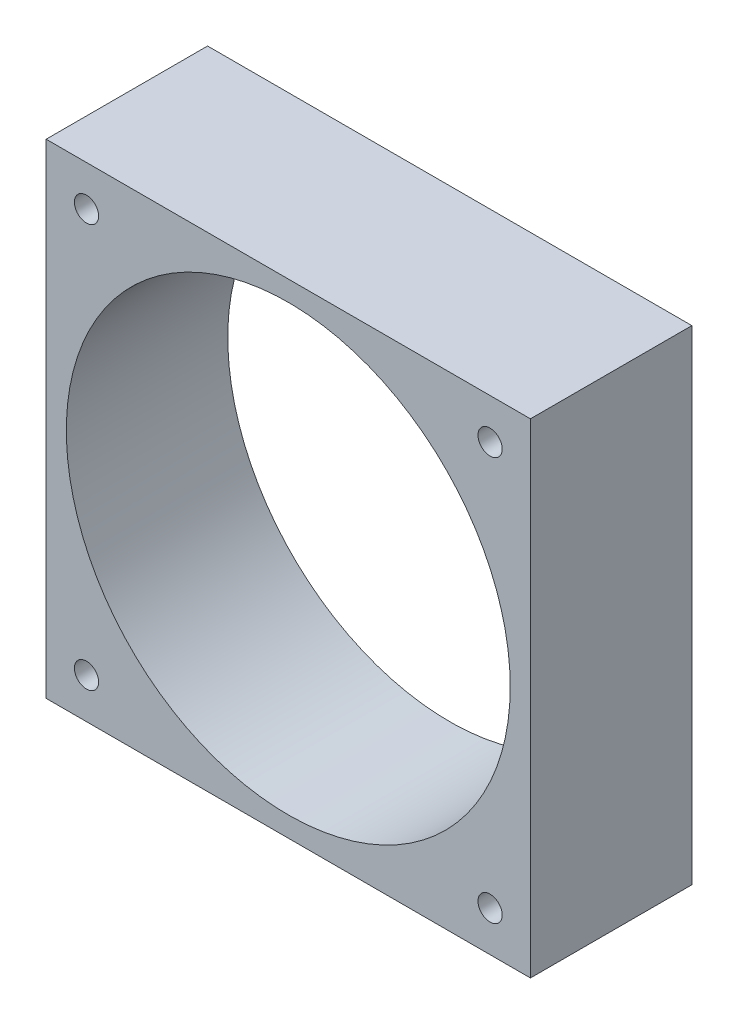
ISO-10303-21;
HEADER;
FILE_DESCRIPTION(('STEP AP214'),'2;1');
FILE_NAME('part.step','',(''),(''),'','','');
FILE_SCHEMA(('AUTOMOTIVE_DESIGN { 1 0 10303 214 1 1 1 1 }'));
ENDSEC;
DATA;
#1=APPLICATION_CONTEXT('core data for automotive mechanical design processes');
#2=APPLICATION_PROTOCOL_DEFINITION('international standard','automotive_design',2000,#1);
#3=PRODUCT_CONTEXT('',#1,'mechanical');
#4=PRODUCT('Part','Part','',(#3));
#5=PRODUCT_RELATED_PRODUCT_CATEGORY('part','',(#4));
#6=PRODUCT_DEFINITION_FORMATION('','',#4);
#7=PRODUCT_DEFINITION_CONTEXT('part definition',#1,'design');
#8=PRODUCT_DEFINITION('design','',#6,#7);
#9=PRODUCT_DEFINITION_SHAPE('','',#8);
#10=(LENGTH_UNIT() NAMED_UNIT(*) SI_UNIT(.MILLI.,.METRE.));
#11=(NAMED_UNIT(*) PLANE_ANGLE_UNIT() SI_UNIT($,.RADIAN.));
#12=(NAMED_UNIT(*) SI_UNIT($,.STERADIAN.) SOLID_ANGLE_UNIT());
#13=UNCERTAINTY_MEASURE_WITH_UNIT(LENGTH_MEASURE(1.E-05),#10,'distance_accuracy_value','');
#14=(GEOMETRIC_REPRESENTATION_CONTEXT(3) GLOBAL_UNCERTAINTY_ASSIGNED_CONTEXT((#13)) GLOBAL_UNIT_ASSIGNED_CONTEXT((#10,
#11,#12)) REPRESENTATION_CONTEXT('',''));
#15=CARTESIAN_POINT('',(0.,0.,0.));
#16=DIRECTION('',(0.,0.,1.));
#17=DIRECTION('',(1.,0.,0.));
#18=AXIS2_PLACEMENT_3D('',#15,#16,#17);
#19=CARTESIAN_POINT('',(0.,0.,20.));
#20=DIRECTION('',(0.,0.,-1.));
#21=DIRECTION('',(-1.,0.,0.));
#22=AXIS2_PLACEMENT_3D('',#19,#20,#21);
#23=PLANE('',#22);
#24=DIRECTION('',(0.,1.,0.));
#25=VECTOR('',#24,1.);
#26=CARTESIAN_POINT('',(30.,-30.,20.));
#27=LINE('',#26,#25);
#28=CARTESIAN_POINT('',(30.,-30.,20.));
#29=VERTEX_POINT('',#28);
#30=CARTESIAN_POINT('',(30.,30.,20.));
#31=VERTEX_POINT('',#30);
#32=EDGE_CURVE('E85',#29,#31,#27,.T.);
#33=ORIENTED_EDGE('',*,*,#32,.T.);
#34=DIRECTION('',(-1.,0.,0.));
#35=VECTOR('',#34,1.);
#36=CARTESIAN_POINT('',(-30.,30.,20.));
#37=LINE('',#36,#35);
#38=CARTESIAN_POINT('',(-30.,30.,20.));
#39=VERTEX_POINT('',#38);
#40=EDGE_CURVE('E80',#31,#39,#37,.T.);
#41=ORIENTED_EDGE('',*,*,#40,.T.);
#42=DIRECTION('',(0.,-1.,0.));
#43=VECTOR('',#42,1.);
#44=CARTESIAN_POINT('',(-30.,-30.,20.));
#45=LINE('',#44,#43);
#46=CARTESIAN_POINT('',(-30.,-30.,20.));
#47=VERTEX_POINT('',#46);
#48=EDGE_CURVE('E83',#39,#47,#45,.T.);
#49=ORIENTED_EDGE('',*,*,#48,.T.);
#50=DIRECTION('',(1.,0.,0.));
#51=VECTOR('',#50,1.);
#52=CARTESIAN_POINT('',(-30.,-30.,20.));
#53=LINE('',#52,#51);
#54=EDGE_CURVE('E50',#47,#29,#53,.T.);
#55=ORIENTED_EDGE('',*,*,#54,.T.);
#56=EDGE_LOOP('',(#33,#41,#49,#55));
#57=FACE_BOUND('',#56,.T.);
#58=CARTESIAN_POINT('',(25.,25.,20.));
#59=DIRECTION('',(0.,0.,1.));
#60=DIRECTION('',(1.,0.,0.));
#61=AXIS2_PLACEMENT_3D('',#58,#59,#60);
#62=CIRCLE('',#61,1.5);
#63=CARTESIAN_POINT('',(26.5,25.,20.));
#64=VERTEX_POINT('',#63);
#65=EDGE_CURVE('E100',#64,#64,#62,.T.);
#66=ORIENTED_EDGE('',*,*,#65,.F.);
#67=EDGE_LOOP('',(#66));
#68=FACE_BOUND('',#67,.T.);
#69=CARTESIAN_POINT('',(-25.,25.,20.));
#70=DIRECTION('',(0.,0.,1.));
#71=DIRECTION('',(1.,0.,0.));
#72=AXIS2_PLACEMENT_3D('',#69,#70,#71);
#73=CIRCLE('',#72,1.5);
#74=CARTESIAN_POINT('',(-23.5,25.,20.));
#75=VERTEX_POINT('',#74);
#76=EDGE_CURVE('E115',#75,#75,#73,.T.);
#77=ORIENTED_EDGE('',*,*,#76,.F.);
#78=EDGE_LOOP('',(#77));
#79=FACE_BOUND('',#78,.T.);
#80=CARTESIAN_POINT('',(-25.,-25.,20.));
#81=DIRECTION('',(0.,0.,1.));
#82=DIRECTION('',(1.,0.,0.));
#83=AXIS2_PLACEMENT_3D('',#80,#81,#82);
#84=CIRCLE('',#83,1.5);
#85=CARTESIAN_POINT('',(-23.5,-25.,20.));
#86=VERTEX_POINT('',#85);
#87=EDGE_CURVE('E121',#86,#86,#84,.T.);
#88=ORIENTED_EDGE('',*,*,#87,.F.);
#89=EDGE_LOOP('',(#88));
#90=FACE_BOUND('',#89,.T.);
#91=CARTESIAN_POINT('',(25.,-25.,20.));
#92=DIRECTION('',(0.,0.,1.));
#93=DIRECTION('',(1.,0.,0.));
#94=AXIS2_PLACEMENT_3D('',#91,#92,#93);
#95=CIRCLE('',#94,1.5);
#96=CARTESIAN_POINT('',(26.5,-25.,20.));
#97=VERTEX_POINT('',#96);
#98=EDGE_CURVE('E127',#97,#97,#95,.T.);
#99=ORIENTED_EDGE('',*,*,#98,.F.);
#100=EDGE_LOOP('',(#99));
#101=FACE_BOUND('',#100,.T.);
#102=CARTESIAN_POINT('',(0.,0.,20.));
#103=DIRECTION('',(0.,0.,1.));
#104=DIRECTION('',(1.,0.,0.));
#105=AXIS2_PLACEMENT_3D('',#102,#103,#104);
#106=CIRCLE('',#105,27.5);
#107=CARTESIAN_POINT('',(27.5,0.,20.));
#108=VERTEX_POINT('',#107);
#109=EDGE_CURVE('E133',#108,#108,#106,.T.);
#110=ORIENTED_EDGE('',*,*,#109,.F.);
#111=EDGE_LOOP('',(#110));
#112=FACE_BOUND('',#111,.T.);
#113=ADVANCED_FACE('F33',(#57,#68,#79,#90,#101,#112),#23,.F.);
#114=CARTESIAN_POINT('',(0.,0.,0.));
#115=DIRECTION('',(0.,0.,-1.));
#116=DIRECTION('',(-1.,0.,0.));
#117=AXIS2_PLACEMENT_3D('',#114,#115,#116);
#118=PLANE('',#117);
#119=CARTESIAN_POINT('',(25.,-25.,0.));
#120=DIRECTION('',(0.,0.,1.));
#121=DIRECTION('',(1.,0.,0.));
#122=AXIS2_PLACEMENT_3D('',#119,#120,#121);
#123=CIRCLE('',#122,1.5);
#124=CARTESIAN_POINT('',(26.5,-25.,0.));
#125=VERTEX_POINT('',#124);
#126=EDGE_CURVE('E130',#125,#125,#123,.T.);
#127=ORIENTED_EDGE('',*,*,#126,.T.);
#128=EDGE_LOOP('',(#127));
#129=FACE_BOUND('',#128,.T.);
#130=CARTESIAN_POINT('',(-25.,25.,0.));
#131=DIRECTION('',(0.,0.,1.));
#132=DIRECTION('',(1.,0.,0.));
#133=AXIS2_PLACEMENT_3D('',#130,#131,#132);
#134=CIRCLE('',#133,1.5);
#135=CARTESIAN_POINT('',(-23.5,25.,0.));
#136=VERTEX_POINT('',#135);
#137=EDGE_CURVE('E118',#136,#136,#134,.T.);
#138=ORIENTED_EDGE('',*,*,#137,.T.);
#139=EDGE_LOOP('',(#138));
#140=FACE_BOUND('',#139,.T.);
#141=DIRECTION('',(0.,1.,0.));
#142=VECTOR('',#141,1.);
#143=CARTESIAN_POINT('',(30.,-30.,0.));
#144=LINE('',#143,#142);
#145=CARTESIAN_POINT('',(30.,-30.,0.));
#146=VERTEX_POINT('',#145);
#147=CARTESIAN_POINT('',(30.,30.,0.));
#148=VERTEX_POINT('',#147);
#149=EDGE_CURVE('E97',#146,#148,#144,.T.);
#150=ORIENTED_EDGE('',*,*,#149,.F.);
#151=DIRECTION('',(1.,0.,0.));
#152=VECTOR('',#151,1.);
#153=CARTESIAN_POINT('',(-30.,-30.,0.));
#154=LINE('',#153,#152);
#155=CARTESIAN_POINT('',(-30.,-30.,0.));
#156=VERTEX_POINT('',#155);
#157=EDGE_CURVE('E73',#156,#146,#154,.T.);
#158=ORIENTED_EDGE('',*,*,#157,.F.);
#159=DIRECTION('',(0.,-1.,0.));
#160=VECTOR('',#159,1.);
#161=CARTESIAN_POINT('',(-30.,-30.,0.));
#162=LINE('',#161,#160);
#163=CARTESIAN_POINT('',(-30.,30.,0.));
#164=VERTEX_POINT('',#163);
#165=EDGE_CURVE('E67',#164,#156,#162,.T.);
#166=ORIENTED_EDGE('',*,*,#165,.F.);
#167=DIRECTION('',(-1.,0.,0.));
#168=VECTOR('',#167,1.);
#169=CARTESIAN_POINT('',(-30.,30.,0.));
#170=LINE('',#169,#168);
#171=EDGE_CURVE('E89',#148,#164,#170,.T.);
#172=ORIENTED_EDGE('',*,*,#171,.F.);
#173=EDGE_LOOP('',(#150,#158,#166,#172));
#174=FACE_BOUND('',#173,.T.);
#175=CARTESIAN_POINT('',(25.,25.,0.));
#176=DIRECTION('',(0.,0.,1.));
#177=DIRECTION('',(1.,0.,0.));
#178=AXIS2_PLACEMENT_3D('',#175,#176,#177);
#179=CIRCLE('',#178,1.5);
#180=CARTESIAN_POINT('',(26.5,25.,0.));
#181=VERTEX_POINT('',#180);
#182=EDGE_CURVE('E112',#181,#181,#179,.T.);
#183=ORIENTED_EDGE('',*,*,#182,.T.);
#184=EDGE_LOOP('',(#183));
#185=FACE_BOUND('',#184,.T.);
#186=CARTESIAN_POINT('',(-25.,-25.,0.));
#187=DIRECTION('',(0.,0.,1.));
#188=DIRECTION('',(1.,0.,0.));
#189=AXIS2_PLACEMENT_3D('',#186,#187,#188);
#190=CIRCLE('',#189,1.5);
#191=CARTESIAN_POINT('',(-23.5,-25.,0.));
#192=VERTEX_POINT('',#191);
#193=EDGE_CURVE('E124',#192,#192,#190,.T.);
#194=ORIENTED_EDGE('',*,*,#193,.T.);
#195=EDGE_LOOP('',(#194));
#196=FACE_BOUND('',#195,.T.);
#197=CARTESIAN_POINT('',(0.,0.,0.));
#198=DIRECTION('',(0.,0.,1.));
#199=DIRECTION('',(1.,0.,0.));
#200=AXIS2_PLACEMENT_3D('',#197,#198,#199);
#201=CIRCLE('',#200,27.5);
#202=CARTESIAN_POINT('',(27.5,0.,0.));
#203=VERTEX_POINT('',#202);
#204=EDGE_CURVE('E136',#203,#203,#201,.T.);
#205=ORIENTED_EDGE('',*,*,#204,.T.);
#206=EDGE_LOOP('',(#205));
#207=FACE_BOUND('',#206,.T.);
#208=ADVANCED_FACE('F108',(#129,#140,#174,#185,#196,#207),#118,.T.);
#209=CARTESIAN_POINT('',(30.,-30.,20.));
#210=DIRECTION('',(-1.,0.,0.));
#211=DIRECTION('',(0.,0.,1.));
#212=AXIS2_PLACEMENT_3D('',#209,#210,#211);
#213=PLANE('',#212);
#214=ORIENTED_EDGE('',*,*,#149,.T.);
#215=DIRECTION('',(0.,0.,-1.));
#216=VECTOR('',#215,1.);
#217=CARTESIAN_POINT('',(30.,30.,20.));
#218=LINE('',#217,#216);
#219=EDGE_CURVE('E11',#31,#148,#218,.T.);
#220=ORIENTED_EDGE('',*,*,#219,.F.);
#221=ORIENTED_EDGE('',*,*,#32,.F.);
#222=DIRECTION('',(0.,0.,-1.));
#223=VECTOR('',#222,1.);
#224=CARTESIAN_POINT('',(30.,-30.,20.));
#225=LINE('',#224,#223);
#226=EDGE_CURVE('E93',#29,#146,#225,.T.);
#227=ORIENTED_EDGE('',*,*,#226,.T.);
#228=EDGE_LOOP('',(#214,#220,#221,#227));
#229=FACE_BOUND('',#228,.T.);
#230=ADVANCED_FACE('F35',(#229),#213,.F.);
#231=CARTESIAN_POINT('',(-30.,30.,20.));
#232=DIRECTION('',(0.,-1.,0.));
#233=DIRECTION('',(0.,0.,-1.));
#234=AXIS2_PLACEMENT_3D('',#231,#232,#233);
#235=PLANE('',#234);
#236=ORIENTED_EDGE('',*,*,#171,.T.);
#237=DIRECTION('',(0.,0.,-1.));
#238=VECTOR('',#237,1.);
#239=CARTESIAN_POINT('',(-30.,30.,20.));
#240=LINE('',#239,#238);
#241=EDGE_CURVE('E42',#39,#164,#240,.T.);
#242=ORIENTED_EDGE('',*,*,#241,.F.);
#243=ORIENTED_EDGE('',*,*,#40,.F.);
#244=ORIENTED_EDGE('',*,*,#219,.T.);
#245=EDGE_LOOP('',(#236,#242,#243,#244));
#246=FACE_BOUND('',#245,.T.);
#247=ADVANCED_FACE('F88',(#246),#235,.F.);
#248=CARTESIAN_POINT('',(-30.,-30.,20.));
#249=DIRECTION('',(1.,0.,0.));
#250=DIRECTION('',(0.,0.,-1.));
#251=AXIS2_PLACEMENT_3D('',#248,#249,#250);
#252=PLANE('',#251);
#253=ORIENTED_EDGE('',*,*,#165,.T.);
#254=DIRECTION('',(0.,0.,-1.));
#255=VECTOR('',#254,1.);
#256=CARTESIAN_POINT('',(-30.,-30.,20.));
#257=LINE('',#256,#255);
#258=EDGE_CURVE('E90',#47,#156,#257,.T.);
#259=ORIENTED_EDGE('',*,*,#258,.F.);
#260=ORIENTED_EDGE('',*,*,#48,.F.);
#261=ORIENTED_EDGE('',*,*,#241,.T.);
#262=EDGE_LOOP('',(#253,#259,#260,#261));
#263=FACE_BOUND('',#262,.T.);
#264=ADVANCED_FACE('F91',(#263),#252,.F.);
#265=CARTESIAN_POINT('',(-30.,-30.,20.));
#266=DIRECTION('',(0.,1.,0.));
#267=DIRECTION('',(0.,0.,1.));
#268=AXIS2_PLACEMENT_3D('',#265,#266,#267);
#269=PLANE('',#268);
#270=ORIENTED_EDGE('',*,*,#157,.T.);
#271=ORIENTED_EDGE('',*,*,#226,.F.);
#272=ORIENTED_EDGE('',*,*,#54,.F.);
#273=ORIENTED_EDGE('',*,*,#258,.T.);
#274=EDGE_LOOP('',(#270,#271,#272,#273));
#275=FACE_BOUND('',#274,.T.);
#276=ADVANCED_FACE('F105',(#275),#269,.F.);
#277=CARTESIAN_POINT('',(25.,25.,20.));
#278=DIRECTION('',(0.,0.,-1.));
#279=DIRECTION('',(-1.,0.,0.));
#280=AXIS2_PLACEMENT_3D('',#277,#278,#279);
#281=CYLINDRICAL_SURFACE('',#280,1.5);
#282=ORIENTED_EDGE('',*,*,#65,.T.);
#283=EDGE_LOOP('',(#282));
#284=FACE_BOUND('',#283,.T.);
#285=ORIENTED_EDGE('',*,*,#182,.F.);
#286=EDGE_LOOP('',(#285));
#287=FACE_BOUND('',#286,.T.);
#288=ADVANCED_FACE('F153',(#284,#287),#281,.F.);
#289=CARTESIAN_POINT('',(-25.,25.,20.));
#290=DIRECTION('',(0.,0.,-1.));
#291=DIRECTION('',(-1.,0.,0.));
#292=AXIS2_PLACEMENT_3D('',#289,#290,#291);
#293=CYLINDRICAL_SURFACE('',#292,1.5);
#294=ORIENTED_EDGE('',*,*,#76,.T.);
#295=EDGE_LOOP('',(#294));
#296=FACE_BOUND('',#295,.T.);
#297=ORIENTED_EDGE('',*,*,#137,.F.);
#298=EDGE_LOOP('',(#297));
#299=FACE_BOUND('',#298,.T.);
#300=ADVANCED_FACE('F199',(#296,#299),#293,.F.);
#301=CARTESIAN_POINT('',(-25.,-25.,20.));
#302=DIRECTION('',(0.,0.,-1.));
#303=DIRECTION('',(-1.,0.,0.));
#304=AXIS2_PLACEMENT_3D('',#301,#302,#303);
#305=CYLINDRICAL_SURFACE('',#304,1.5);
#306=ORIENTED_EDGE('',*,*,#87,.T.);
#307=EDGE_LOOP('',(#306));
#308=FACE_BOUND('',#307,.T.);
#309=ORIENTED_EDGE('',*,*,#193,.F.);
#310=EDGE_LOOP('',(#309));
#311=FACE_BOUND('',#310,.T.);
#312=ADVANCED_FACE('F207',(#308,#311),#305,.F.);
#313=CARTESIAN_POINT('',(25.,-25.,20.));
#314=DIRECTION('',(0.,0.,-1.));
#315=DIRECTION('',(-1.,0.,0.));
#316=AXIS2_PLACEMENT_3D('',#313,#314,#315);
#317=CYLINDRICAL_SURFACE('',#316,1.5);
#318=ORIENTED_EDGE('',*,*,#98,.T.);
#319=EDGE_LOOP('',(#318));
#320=FACE_BOUND('',#319,.T.);
#321=ORIENTED_EDGE('',*,*,#126,.F.);
#322=EDGE_LOOP('',(#321));
#323=FACE_BOUND('',#322,.T.);
#324=ADVANCED_FACE('F215',(#320,#323),#317,.F.);
#325=CARTESIAN_POINT('',(0.,0.,20.));
#326=DIRECTION('',(0.,0.,-1.));
#327=DIRECTION('',(-1.,0.,0.));
#328=AXIS2_PLACEMENT_3D('',#325,#326,#327);
#329=CYLINDRICAL_SURFACE('',#328,27.5);
#330=ORIENTED_EDGE('',*,*,#109,.T.);
#331=EDGE_LOOP('',(#330));
#332=FACE_BOUND('',#331,.T.);
#333=ORIENTED_EDGE('',*,*,#204,.F.);
#334=EDGE_LOOP('',(#333));
#335=FACE_BOUND('',#334,.T.);
#336=ADVANCED_FACE('F142',(#332,#335),#329,.F.);
#337=CLOSED_SHELL('',(#113,#208,#230,#247,#264,#276,#288,#300,#312,#324,#336));
#338=MANIFOLD_SOLID_BREP('B2',#337);
#339=ADVANCED_BREP_SHAPE_REPRESENTATION('',(#18,#338),#14);
#340=SHAPE_DEFINITION_REPRESENTATION(#9,#339);
ENDSEC;
END-ISO-10303-21;
